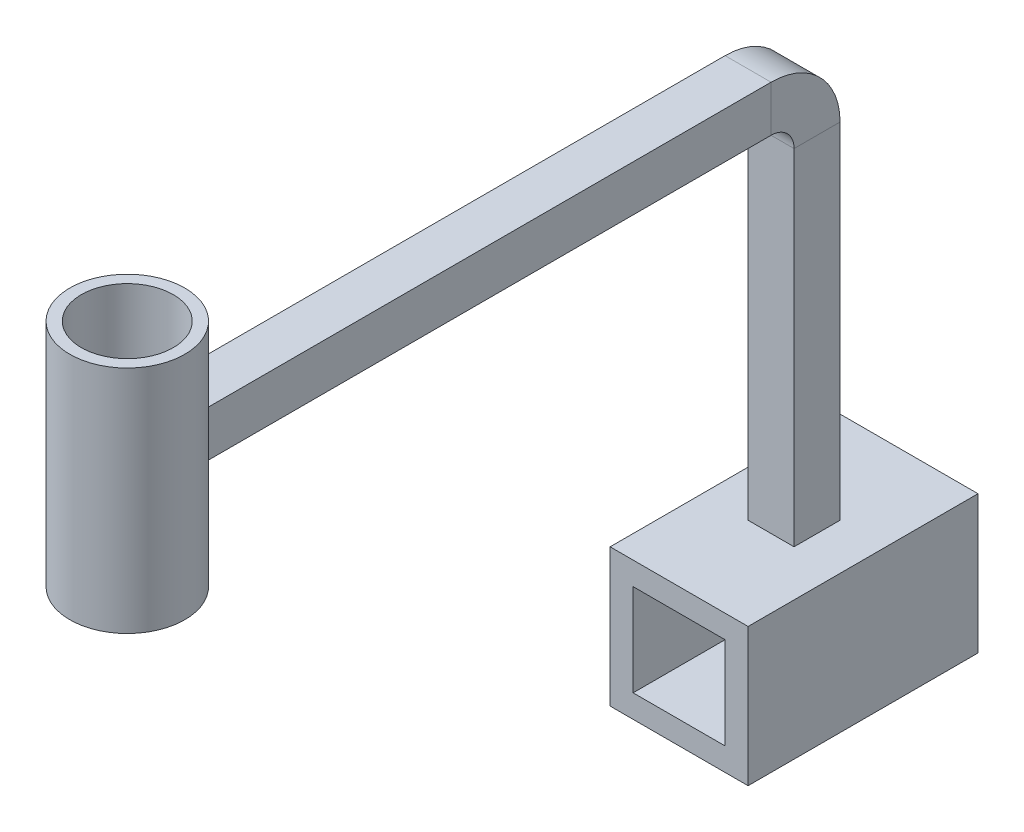
ISO-10303-21;
HEADER;
FILE_DESCRIPTION(('STEP AP214'),'2;1');
FILE_NAME('part.step','',(''),(''),'','','');
FILE_SCHEMA(('AUTOMOTIVE_DESIGN { 1 0 10303 214 1 1 1 1 }'));
ENDSEC;
DATA;
#1=APPLICATION_CONTEXT('core data for automotive mechanical design processes');
#2=APPLICATION_PROTOCOL_DEFINITION('international standard','automotive_design',2000,#1);
#3=PRODUCT_CONTEXT('',#1,'mechanical');
#4=PRODUCT('Part','Part','',(#3));
#5=PRODUCT_RELATED_PRODUCT_CATEGORY('part','',(#4));
#6=PRODUCT_DEFINITION_FORMATION('','',#4);
#7=PRODUCT_DEFINITION_CONTEXT('part definition',#1,'design');
#8=PRODUCT_DEFINITION('design','',#6,#7);
#9=PRODUCT_DEFINITION_SHAPE('','',#8);
#10=(LENGTH_UNIT() NAMED_UNIT(*) SI_UNIT(.MILLI.,.METRE.));
#11=(NAMED_UNIT(*) PLANE_ANGLE_UNIT() SI_UNIT($,.RADIAN.));
#12=(NAMED_UNIT(*) SI_UNIT($,.STERADIAN.) SOLID_ANGLE_UNIT());
#13=UNCERTAINTY_MEASURE_WITH_UNIT(LENGTH_MEASURE(1.E-05),#10,'distance_accuracy_value','');
#14=(GEOMETRIC_REPRESENTATION_CONTEXT(3) GLOBAL_UNCERTAINTY_ASSIGNED_CONTEXT((#13)) GLOBAL_UNIT_ASSIGNED_CONTEXT((#10,
#11,#12)) REPRESENTATION_CONTEXT('',''));
#15=CARTESIAN_POINT('',(0.,0.,0.));
#16=DIRECTION('',(0.,0.,1.));
#17=DIRECTION('',(1.,0.,0.));
#18=AXIS2_PLACEMENT_3D('',#15,#16,#17);
#19=CARTESIAN_POINT('',(-3.,3.,10.));
#20=DIRECTION('',(0.,-1.,0.));
#21=DIRECTION('',(0.,0.,-1.));
#22=AXIS2_PLACEMENT_3D('',#19,#20,#21);
#23=PLANE('',#22);
#24=DIRECTION('',(-1.,0.,0.));
#25=VECTOR('',#24,1.);
#26=CARTESIAN_POINT('',(-3.,3.,0.));
#27=LINE('',#26,#25);
#28=CARTESIAN_POINT('',(3.,3.,0.));
#29=VERTEX_POINT('',#28);
#30=CARTESIAN_POINT('',(-3.,3.,0.));
#31=VERTEX_POINT('',#30);
#32=EDGE_CURVE('E289',#29,#31,#27,.T.);
#33=ORIENTED_EDGE('',*,*,#32,.T.);
#34=DIRECTION('',(0.,0.,-1.));
#35=VECTOR('',#34,1.);
#36=CARTESIAN_POINT('',(-3.,3.,10.));
#37=LINE('',#36,#35);
#38=CARTESIAN_POINT('',(-3.,3.,10.));
#39=VERTEX_POINT('',#38);
#40=EDGE_CURVE('E299',#39,#31,#37,.T.);
#41=ORIENTED_EDGE('',*,*,#40,.F.);
#42=DIRECTION('',(-1.,0.,0.));
#43=VECTOR('',#42,1.);
#44=CARTESIAN_POINT('',(-3.,3.,10.));
#45=LINE('',#44,#43);
#46=CARTESIAN_POINT('',(3.,3.,10.));
#47=VERTEX_POINT('',#46);
#48=EDGE_CURVE('E279',#47,#39,#45,.T.);
#49=ORIENTED_EDGE('',*,*,#48,.F.);
#50=DIRECTION('',(0.,0.,-1.));
#51=VECTOR('',#50,1.);
#52=CARTESIAN_POINT('',(3.,3.,10.));
#53=LINE('',#52,#51);
#54=EDGE_CURVE('E52',#47,#29,#53,.T.);
#55=ORIENTED_EDGE('',*,*,#54,.T.);
#56=EDGE_LOOP('',(#33,#41,#49,#55));
#57=FACE_BOUND('',#56,.T.);
#58=DIRECTION('',(0.,0.,1.));
#59=VECTOR('',#58,1.);
#60=CARTESIAN_POINT('',(-0.999999999999999,3.,6.));
#61=LINE('',#60,#59);
#62=CARTESIAN_POINT('',(-0.999999999999999,3.,4.));
#63=VERTEX_POINT('',#62);
#64=CARTESIAN_POINT('',(-0.999999999999999,3.,6.));
#65=VERTEX_POINT('',#64);
#66=EDGE_CURVE('E211',#63,#65,#61,.T.);
#67=ORIENTED_EDGE('',*,*,#66,.F.);
#68=DIRECTION('',(-1.,0.,0.));
#69=VECTOR('',#68,1.);
#70=CARTESIAN_POINT('',(1.,3.,4.));
#71=LINE('',#70,#69);
#72=CARTESIAN_POINT('',(1.,3.,4.));
#73=VERTEX_POINT('',#72);
#74=EDGE_CURVE('E185',#73,#63,#71,.T.);
#75=ORIENTED_EDGE('',*,*,#74,.F.);
#76=DIRECTION('',(0.,0.,-1.));
#77=VECTOR('',#76,1.);
#78=CARTESIAN_POINT('',(1.,3.,6.));
#79=LINE('',#78,#77);
#80=CARTESIAN_POINT('',(1.,3.,6.));
#81=VERTEX_POINT('',#80);
#82=EDGE_CURVE('E171',#81,#73,#79,.T.);
#83=ORIENTED_EDGE('',*,*,#82,.F.);
#84=DIRECTION('',(1.,0.,0.));
#85=VECTOR('',#84,1.);
#86=CARTESIAN_POINT('',(1.,3.,6.));
#87=LINE('',#86,#85);
#88=EDGE_CURVE('E196',#65,#81,#87,.T.);
#89=ORIENTED_EDGE('',*,*,#88,.F.);
#90=EDGE_LOOP('',(#67,#75,#83,#89));
#91=FACE_BOUND('',#90,.T.);
#92=ADVANCED_FACE('F44',(#57,#91),#23,.F.);
#93=CARTESIAN_POINT('',(0.,0.,10.));
#94=DIRECTION('',(0.,0.,1.));
#95=DIRECTION('',(1.,0.,0.));
#96=AXIS2_PLACEMENT_3D('',#93,#94,#95);
#97=PLANE('',#96);
#98=DIRECTION('',(0.,1.,0.));
#99=VECTOR('',#98,1.);
#100=CARTESIAN_POINT('',(3.,3.,10.));
#101=LINE('',#100,#99);
#102=CARTESIAN_POINT('',(3.,-3.,10.));
#103=VERTEX_POINT('',#102);
#104=EDGE_CURVE('E276',#103,#47,#101,.T.);
#105=ORIENTED_EDGE('',*,*,#104,.T.);
#106=ORIENTED_EDGE('',*,*,#48,.T.);
#107=DIRECTION('',(0.,-1.,0.));
#108=VECTOR('',#107,1.);
#109=CARTESIAN_POINT('',(-3.,3.,10.));
#110=LINE('',#109,#108);
#111=CARTESIAN_POINT('',(-3.,-3.,10.));
#112=VERTEX_POINT('',#111);
#113=EDGE_CURVE('E282',#39,#112,#110,.T.);
#114=ORIENTED_EDGE('',*,*,#113,.T.);
#115=DIRECTION('',(1.,0.,0.));
#116=VECTOR('',#115,1.);
#117=CARTESIAN_POINT('',(-3.,-3.,10.));
#118=LINE('',#117,#116);
#119=EDGE_CURVE('E284',#112,#103,#118,.T.);
#120=ORIENTED_EDGE('',*,*,#119,.T.);
#121=EDGE_LOOP('',(#105,#106,#114,#120));
#122=FACE_BOUND('',#121,.T.);
#123=DIRECTION('',(-1.,0.,0.));
#124=VECTOR('',#123,1.);
#125=CARTESIAN_POINT('',(-2.,2.,10.));
#126=LINE('',#125,#124);
#127=CARTESIAN_POINT('',(2.,2.,10.));
#128=VERTEX_POINT('',#127);
#129=CARTESIAN_POINT('',(-2.,2.,10.));
#130=VERTEX_POINT('',#129);
#131=EDGE_CURVE('E247',#128,#130,#126,.T.);
#132=ORIENTED_EDGE('',*,*,#131,.F.);
#133=DIRECTION('',(0.,1.,0.));
#134=VECTOR('',#133,1.);
#135=CARTESIAN_POINT('',(2.,2.,10.));
#136=LINE('',#135,#134);
#137=CARTESIAN_POINT('',(2.,-2.,10.));
#138=VERTEX_POINT('',#137);
#139=EDGE_CURVE('E245',#138,#128,#136,.T.);
#140=ORIENTED_EDGE('',*,*,#139,.F.);
#141=DIRECTION('',(1.,0.,0.));
#142=VECTOR('',#141,1.);
#143=CARTESIAN_POINT('',(-2.,-2.,10.));
#144=LINE('',#143,#142);
#145=CARTESIAN_POINT('',(-2.,-2.,10.));
#146=VERTEX_POINT('',#145);
#147=EDGE_CURVE('E253',#146,#138,#144,.T.);
#148=ORIENTED_EDGE('',*,*,#147,.F.);
#149=DIRECTION('',(0.,-1.,0.));
#150=VECTOR('',#149,1.);
#151=CARTESIAN_POINT('',(-2.,2.,10.));
#152=LINE('',#151,#150);
#153=EDGE_CURVE('E250',#130,#146,#152,.T.);
#154=ORIENTED_EDGE('',*,*,#153,.F.);
#155=EDGE_LOOP('',(#132,#140,#148,#154));
#156=FACE_BOUND('',#155,.T.);
#157=ADVANCED_FACE('F323',(#122,#156),#97,.T.);
#158=CARTESIAN_POINT('',(0.,0.,0.));
#159=DIRECTION('',(0.,0.,1.));
#160=DIRECTION('',(1.,0.,0.));
#161=AXIS2_PLACEMENT_3D('',#158,#159,#160);
#162=PLANE('',#161);
#163=DIRECTION('',(0.,1.,0.));
#164=VECTOR('',#163,1.);
#165=CARTESIAN_POINT('',(3.,3.,0.));
#166=LINE('',#165,#164);
#167=CARTESIAN_POINT('',(3.,-3.,0.));
#168=VERTEX_POINT('',#167);
#169=EDGE_CURVE('E275',#168,#29,#166,.T.);
#170=ORIENTED_EDGE('',*,*,#169,.F.);
#171=DIRECTION('',(1.,0.,0.));
#172=VECTOR('',#171,1.);
#173=CARTESIAN_POINT('',(-3.,-3.,0.));
#174=LINE('',#173,#172);
#175=CARTESIAN_POINT('',(-3.,-3.,0.));
#176=VERTEX_POINT('',#175);
#177=EDGE_CURVE('E280',#176,#168,#174,.T.);
#178=ORIENTED_EDGE('',*,*,#177,.F.);
#179=DIRECTION('',(0.,-1.,0.));
#180=VECTOR('',#179,1.);
#181=CARTESIAN_POINT('',(-3.,3.,0.));
#182=LINE('',#181,#180);
#183=EDGE_CURVE('E291',#31,#176,#182,.T.);
#184=ORIENTED_EDGE('',*,*,#183,.F.);
#185=ORIENTED_EDGE('',*,*,#32,.F.);
#186=EDGE_LOOP('',(#170,#178,#184,#185));
#187=FACE_BOUND('',#186,.T.);
#188=DIRECTION('',(0.,1.,0.));
#189=VECTOR('',#188,1.);
#190=CARTESIAN_POINT('',(2.,2.,0.));
#191=LINE('',#190,#189);
#192=CARTESIAN_POINT('',(2.,-2.,0.));
#193=VERTEX_POINT('',#192);
#194=CARTESIAN_POINT('',(2.,2.,0.));
#195=VERTEX_POINT('',#194);
#196=EDGE_CURVE('E239',#193,#195,#191,.T.);
#197=ORIENTED_EDGE('',*,*,#196,.T.);
#198=DIRECTION('',(-1.,0.,0.));
#199=VECTOR('',#198,1.);
#200=CARTESIAN_POINT('',(-2.,2.,0.));
#201=LINE('',#200,#199);
#202=CARTESIAN_POINT('',(-2.,2.,0.));
#203=VERTEX_POINT('',#202);
#204=EDGE_CURVE('E258',#195,#203,#201,.T.);
#205=ORIENTED_EDGE('',*,*,#204,.T.);
#206=DIRECTION('',(0.,-1.,0.));
#207=VECTOR('',#206,1.);
#208=CARTESIAN_POINT('',(-2.,2.,0.));
#209=LINE('',#208,#207);
#210=CARTESIAN_POINT('',(-2.,-2.,0.));
#211=VERTEX_POINT('',#210);
#212=EDGE_CURVE('E261',#203,#211,#209,.T.);
#213=ORIENTED_EDGE('',*,*,#212,.T.);
#214=DIRECTION('',(1.,0.,0.));
#215=VECTOR('',#214,1.);
#216=CARTESIAN_POINT('',(-2.,-2.,0.));
#217=LINE('',#216,#215);
#218=EDGE_CURVE('E248',#211,#193,#217,.T.);
#219=ORIENTED_EDGE('',*,*,#218,.T.);
#220=EDGE_LOOP('',(#197,#205,#213,#219));
#221=FACE_BOUND('',#220,.T.);
#222=ADVANCED_FACE('F312',(#187,#221),#162,.F.);
#223=CARTESIAN_POINT('',(3.,3.,10.));
#224=DIRECTION('',(-1.,0.,0.));
#225=DIRECTION('',(0.,-1.,0.));
#226=AXIS2_PLACEMENT_3D('',#223,#224,#225);
#227=PLANE('',#226);
#228=ORIENTED_EDGE('',*,*,#169,.T.);
#229=ORIENTED_EDGE('',*,*,#54,.F.);
#230=ORIENTED_EDGE('',*,*,#104,.F.);
#231=DIRECTION('',(0.,0.,-1.));
#232=VECTOR('',#231,1.);
#233=CARTESIAN_POINT('',(3.,-3.,10.));
#234=LINE('',#233,#232);
#235=EDGE_CURVE('E286',#103,#168,#234,.T.);
#236=ORIENTED_EDGE('',*,*,#235,.T.);
#237=EDGE_LOOP('',(#228,#229,#230,#236));
#238=FACE_BOUND('',#237,.T.);
#239=ADVANCED_FACE('F46',(#238),#227,.F.);
#240=CARTESIAN_POINT('',(-3.,3.,10.));
#241=DIRECTION('',(1.,0.,0.));
#242=DIRECTION('',(0.,1.,0.));
#243=AXIS2_PLACEMENT_3D('',#240,#241,#242);
#244=PLANE('',#243);
#245=ORIENTED_EDGE('',*,*,#183,.T.);
#246=DIRECTION('',(0.,0.,-1.));
#247=VECTOR('',#246,1.);
#248=CARTESIAN_POINT('',(-3.,-3.,10.));
#249=LINE('',#248,#247);
#250=EDGE_CURVE('E296',#112,#176,#249,.T.);
#251=ORIENTED_EDGE('',*,*,#250,.F.);
#252=ORIENTED_EDGE('',*,*,#113,.F.);
#253=ORIENTED_EDGE('',*,*,#40,.T.);
#254=EDGE_LOOP('',(#245,#251,#252,#253));
#255=FACE_BOUND('',#254,.T.);
#256=ADVANCED_FACE('F317',(#255),#244,.F.);
#257=CARTESIAN_POINT('',(-3.,-3.,10.));
#258=DIRECTION('',(0.,1.,0.));
#259=DIRECTION('',(0.,0.,1.));
#260=AXIS2_PLACEMENT_3D('',#257,#258,#259);
#261=PLANE('',#260);
#262=ORIENTED_EDGE('',*,*,#177,.T.);
#263=ORIENTED_EDGE('',*,*,#235,.F.);
#264=ORIENTED_EDGE('',*,*,#119,.F.);
#265=ORIENTED_EDGE('',*,*,#250,.T.);
#266=EDGE_LOOP('',(#262,#263,#264,#265));
#267=FACE_BOUND('',#266,.T.);
#268=ADVANCED_FACE('F321',(#267),#261,.F.);
#269=CARTESIAN_POINT('',(2.,2.,10.));
#270=DIRECTION('',(-1.,0.,0.));
#271=DIRECTION('',(0.,-1.,0.));
#272=AXIS2_PLACEMENT_3D('',#269,#270,#271);
#273=PLANE('',#272);
#274=ORIENTED_EDGE('',*,*,#196,.F.);
#275=DIRECTION('',(0.,0.,-1.));
#276=VECTOR('',#275,1.);
#277=CARTESIAN_POINT('',(2.,-2.,10.));
#278=LINE('',#277,#276);
#279=EDGE_CURVE('E255',#138,#193,#278,.T.);
#280=ORIENTED_EDGE('',*,*,#279,.F.);
#281=ORIENTED_EDGE('',*,*,#139,.T.);
#282=DIRECTION('',(0.,0.,-1.));
#283=VECTOR('',#282,1.);
#284=CARTESIAN_POINT('',(2.,2.,10.));
#285=LINE('',#284,#283);
#286=EDGE_CURVE('E272',#128,#195,#285,.T.);
#287=ORIENTED_EDGE('',*,*,#286,.T.);
#288=EDGE_LOOP('',(#274,#280,#281,#287));
#289=FACE_BOUND('',#288,.T.);
#290=ADVANCED_FACE('F340',(#289),#273,.T.);
#291=CARTESIAN_POINT('',(-2.,2.,10.));
#292=DIRECTION('',(0.,-1.,0.));
#293=DIRECTION('',(0.,0.,-1.));
#294=AXIS2_PLACEMENT_3D('',#291,#292,#293);
#295=PLANE('',#294);
#296=ORIENTED_EDGE('',*,*,#204,.F.);
#297=ORIENTED_EDGE('',*,*,#286,.F.);
#298=ORIENTED_EDGE('',*,*,#131,.T.);
#299=DIRECTION('',(0.,0.,-1.));
#300=VECTOR('',#299,1.);
#301=CARTESIAN_POINT('',(-2.,2.,10.));
#302=LINE('',#301,#300);
#303=EDGE_CURVE('E270',#130,#203,#302,.T.);
#304=ORIENTED_EDGE('',*,*,#303,.T.);
#305=EDGE_LOOP('',(#296,#297,#298,#304));
#306=FACE_BOUND('',#305,.T.);
#307=ADVANCED_FACE('F334',(#306),#295,.T.);
#308=CARTESIAN_POINT('',(-2.,2.,10.));
#309=DIRECTION('',(1.,0.,0.));
#310=DIRECTION('',(0.,1.,0.));
#311=AXIS2_PLACEMENT_3D('',#308,#309,#310);
#312=PLANE('',#311);
#313=ORIENTED_EDGE('',*,*,#212,.F.);
#314=ORIENTED_EDGE('',*,*,#303,.F.);
#315=ORIENTED_EDGE('',*,*,#153,.T.);
#316=DIRECTION('',(0.,0.,-1.));
#317=VECTOR('',#316,1.);
#318=CARTESIAN_POINT('',(-2.,-2.,10.));
#319=LINE('',#318,#317);
#320=EDGE_CURVE('E268',#146,#211,#319,.T.);
#321=ORIENTED_EDGE('',*,*,#320,.T.);
#322=EDGE_LOOP('',(#313,#314,#315,#321));
#323=FACE_BOUND('',#322,.T.);
#324=ADVANCED_FACE('F337',(#323),#312,.T.);
#325=CARTESIAN_POINT('',(-2.,-2.,10.));
#326=DIRECTION('',(0.,1.,0.));
#327=DIRECTION('',(0.,0.,1.));
#328=AXIS2_PLACEMENT_3D('',#325,#326,#327);
#329=PLANE('',#328);
#330=ORIENTED_EDGE('',*,*,#218,.F.);
#331=ORIENTED_EDGE('',*,*,#320,.F.);
#332=ORIENTED_EDGE('',*,*,#147,.T.);
#333=ORIENTED_EDGE('',*,*,#279,.T.);
#334=EDGE_LOOP('',(#330,#331,#332,#333));
#335=FACE_BOUND('',#334,.T.);
#336=ADVANCED_FACE('F343',(#335),#329,.T.);
#337=CARTESIAN_POINT('',(1.,3.,6.));
#338=DIRECTION('',(1.,0.,0.));
#339=DIRECTION('',(0.,0.,-1.));
#340=AXIS2_PLACEMENT_3D('',#337,#338,#339);
#341=PLANE('',#340);
#342=DIRECTION('',(0.,1.,0.));
#343=VECTOR('',#342,1.);
#344=CARTESIAN_POINT('',(1.,3.,4.));
#345=LINE('',#344,#343);
#346=CARTESIAN_POINT('',(1.,18.,4.));
#347=VERTEX_POINT('',#346);
#348=EDGE_CURVE('E189',#73,#347,#345,.T.);
#349=ORIENTED_EDGE('',*,*,#348,.T.);
#350=DIRECTION('',(0.,0.,-1.));
#351=VECTOR('',#350,1.);
#352=CARTESIAN_POINT('',(1.,18.,6.));
#353=LINE('',#352,#351);
#354=CARTESIAN_POINT('',(1.,18.,6.));
#355=VERTEX_POINT('',#354);
#356=EDGE_CURVE('E186',#355,#347,#353,.T.);
#357=ORIENTED_EDGE('',*,*,#356,.F.);
#358=DIRECTION('',(0.,1.,0.));
#359=VECTOR('',#358,1.);
#360=CARTESIAN_POINT('',(1.,3.,6.));
#361=LINE('',#360,#359);
#362=EDGE_CURVE('E190',#81,#355,#361,.T.);
#363=ORIENTED_EDGE('',*,*,#362,.F.);
#364=ORIENTED_EDGE('',*,*,#82,.T.);
#365=EDGE_LOOP('',(#349,#357,#363,#364));
#366=FACE_BOUND('',#365,.T.);
#367=ADVANCED_FACE('F345',(#366),#341,.T.);
#368=CARTESIAN_POINT('',(1.,3.,4.));
#369=DIRECTION('',(0.,0.,-1.));
#370=DIRECTION('',(0.,1.,0.));
#371=AXIS2_PLACEMENT_3D('',#368,#369,#370);
#372=PLANE('',#371);
#373=DIRECTION('',(0.,1.,0.));
#374=VECTOR('',#373,1.);
#375=CARTESIAN_POINT('',(-0.999999999999999,3.,4.));
#376=LINE('',#375,#374);
#377=CARTESIAN_POINT('',(-0.999999999999999,18.,4.));
#378=VERTEX_POINT('',#377);
#379=EDGE_CURVE('E214',#63,#378,#376,.T.);
#380=ORIENTED_EDGE('',*,*,#379,.T.);
#381=DIRECTION('',(-1.,0.,0.));
#382=VECTOR('',#381,1.);
#383=CARTESIAN_POINT('',(1.,18.,4.));
#384=LINE('',#383,#382);
#385=EDGE_CURVE('E193',#347,#378,#384,.T.);
#386=ORIENTED_EDGE('',*,*,#385,.F.);
#387=ORIENTED_EDGE('',*,*,#348,.F.);
#388=ORIENTED_EDGE('',*,*,#74,.T.);
#389=EDGE_LOOP('',(#380,#386,#387,#388));
#390=FACE_BOUND('',#389,.T.);
#391=ADVANCED_FACE('F351',(#390),#372,.T.);
#392=CARTESIAN_POINT('',(-0.999999999999999,3.,6.));
#393=DIRECTION('',(-1.,0.,0.));
#394=DIRECTION('',(0.,0.,1.));
#395=AXIS2_PLACEMENT_3D('',#392,#393,#394);
#396=PLANE('',#395);
#397=DIRECTION('',(0.,1.,0.));
#398=VECTOR('',#397,1.);
#399=CARTESIAN_POINT('',(-0.999999999999999,3.,6.));
#400=LINE('',#399,#398);
#401=CARTESIAN_POINT('',(-0.999999999999999,18.,6.));
#402=VERTEX_POINT('',#401);
#403=EDGE_CURVE('E230',#65,#402,#400,.T.);
#404=ORIENTED_EDGE('',*,*,#403,.T.);
#405=DIRECTION('',(0.,0.,1.));
#406=VECTOR('',#405,1.);
#407=CARTESIAN_POINT('',(-0.999999999999999,18.,6.));
#408=LINE('',#407,#406);
#409=EDGE_CURVE('E217',#378,#402,#408,.T.);
#410=ORIENTED_EDGE('',*,*,#409,.F.);
#411=ORIENTED_EDGE('',*,*,#379,.F.);
#412=ORIENTED_EDGE('',*,*,#66,.T.);
#413=EDGE_LOOP('',(#404,#410,#411,#412));
#414=FACE_BOUND('',#413,.T.);
#415=ADVANCED_FACE('F402',(#414),#396,.T.);
#416=CARTESIAN_POINT('',(1.,3.,6.));
#417=DIRECTION('',(0.,0.,1.));
#418=DIRECTION('',(0.,-1.,0.));
#419=AXIS2_PLACEMENT_3D('',#416,#417,#418);
#420=PLANE('',#419);
#421=DIRECTION('',(1.,0.,0.));
#422=VECTOR('',#421,1.);
#423=CARTESIAN_POINT('',(1.,18.,6.));
#424=LINE('',#423,#422);
#425=EDGE_CURVE('E206',#402,#355,#424,.T.);
#426=ORIENTED_EDGE('',*,*,#425,.F.);
#427=ORIENTED_EDGE('',*,*,#403,.F.);
#428=ORIENTED_EDGE('',*,*,#88,.T.);
#429=ORIENTED_EDGE('',*,*,#362,.T.);
#430=EDGE_LOOP('',(#426,#427,#428,#429));
#431=FACE_BOUND('',#430,.T.);
#432=ADVANCED_FACE('F412',(#431),#420,.T.);
#433=CARTESIAN_POINT('',(1.,18.,6.));
#434=DIRECTION('',(1.,0.,0.));
#435=DIRECTION('',(0.,0.,-1.));
#436=AXIS2_PLACEMENT_3D('',#433,#434,#435);
#437=PLANE('',#436);
#438=CARTESIAN_POINT('',(1.,18.,7.));
#439=DIRECTION('',(1.,0.,0.));
#440=DIRECTION('',(0.,0.,-1.));
#441=AXIS2_PLACEMENT_3D('',#438,#439,#440);
#442=CIRCLE('',#441,3.);
#443=CARTESIAN_POINT('',(1.,21.,7.));
#444=VERTEX_POINT('',#443);
#445=EDGE_CURVE('E199',#347,#444,#442,.T.);
#446=ORIENTED_EDGE('',*,*,#445,.T.);
#447=DIRECTION('',(0.,1.,0.));
#448=VECTOR('',#447,1.);
#449=CARTESIAN_POINT('',(1.,19.,7.));
#450=LINE('',#449,#448);
#451=CARTESIAN_POINT('',(1.,19.,7.));
#452=VERTEX_POINT('',#451);
#453=EDGE_CURVE('E197',#452,#444,#450,.T.);
#454=ORIENTED_EDGE('',*,*,#453,.F.);
#455=CARTESIAN_POINT('',(1.,18.,7.));
#456=DIRECTION('',(1.,0.,0.));
#457=DIRECTION('',(0.,0.,-1.));
#458=AXIS2_PLACEMENT_3D('',#455,#456,#457);
#459=CIRCLE('',#458,1.);
#460=EDGE_CURVE('E200',#355,#452,#459,.T.);
#461=ORIENTED_EDGE('',*,*,#460,.F.);
#462=ORIENTED_EDGE('',*,*,#356,.T.);
#463=EDGE_LOOP('',(#446,#454,#461,#462));
#464=FACE_BOUND('',#463,.T.);
#465=ADVANCED_FACE('F422',(#464),#437,.T.);
#466=CARTESIAN_POINT('',(0.,18.,7.));
#467=DIRECTION('',(1.,0.,0.));
#468=DIRECTION('',(0.,0.,-1.));
#469=AXIS2_PLACEMENT_3D('',#466,#467,#468);
#470=CYLINDRICAL_SURFACE('',#469,3.);
#471=CARTESIAN_POINT('',(-0.999999999999999,18.,7.));
#472=DIRECTION('',(1.,0.,0.));
#473=DIRECTION('',(0.,0.,-1.));
#474=AXIS2_PLACEMENT_3D('',#471,#472,#473);
#475=CIRCLE('',#474,3.);
#476=CARTESIAN_POINT('',(-0.999999999999999,21.,7.));
#477=VERTEX_POINT('',#476);
#478=EDGE_CURVE('E220',#378,#477,#475,.T.);
#479=ORIENTED_EDGE('',*,*,#478,.T.);
#480=DIRECTION('',(-1.,0.,0.));
#481=VECTOR('',#480,1.);
#482=CARTESIAN_POINT('',(1.,21.,7.));
#483=LINE('',#482,#481);
#484=EDGE_CURVE('E203',#444,#477,#483,.T.);
#485=ORIENTED_EDGE('',*,*,#484,.F.);
#486=ORIENTED_EDGE('',*,*,#445,.F.);
#487=ORIENTED_EDGE('',*,*,#385,.T.);
#488=EDGE_LOOP('',(#479,#485,#486,#487));
#489=FACE_BOUND('',#488,.T.);
#490=ADVANCED_FACE('F432',(#489),#470,.T.);
#491=CARTESIAN_POINT('',(-0.999999999999999,18.,6.));
#492=DIRECTION('',(-1.,0.,0.));
#493=DIRECTION('',(0.,0.,1.));
#494=AXIS2_PLACEMENT_3D('',#491,#492,#493);
#495=PLANE('',#494);
#496=CARTESIAN_POINT('',(-0.999999999999999,18.,7.));
#497=DIRECTION('',(1.,0.,0.));
#498=DIRECTION('',(0.,0.,-1.));
#499=AXIS2_PLACEMENT_3D('',#496,#497,#498);
#500=CIRCLE('',#499,1.);
#501=CARTESIAN_POINT('',(-0.999999999999999,19.,7.));
#502=VERTEX_POINT('',#501);
#503=EDGE_CURVE('E235',#402,#502,#500,.T.);
#504=ORIENTED_EDGE('',*,*,#503,.T.);
#505=DIRECTION('',(0.,-1.,0.));
#506=VECTOR('',#505,1.);
#507=CARTESIAN_POINT('',(-0.999999999999999,19.,7.));
#508=LINE('',#507,#506);
#509=EDGE_CURVE('E223',#477,#502,#508,.T.);
#510=ORIENTED_EDGE('',*,*,#509,.F.);
#511=ORIENTED_EDGE('',*,*,#478,.F.);
#512=ORIENTED_EDGE('',*,*,#409,.T.);
#513=EDGE_LOOP('',(#504,#510,#511,#512));
#514=FACE_BOUND('',#513,.T.);
#515=ADVANCED_FACE('F442',(#514),#495,.T.);
#516=CARTESIAN_POINT('',(0.,18.,7.));
#517=DIRECTION('',(1.,0.,0.));
#518=DIRECTION('',(0.,0.,-1.));
#519=AXIS2_PLACEMENT_3D('',#516,#517,#518);
#520=CYLINDRICAL_SURFACE('',#519,1.);
#521=DIRECTION('',(1.,0.,0.));
#522=VECTOR('',#521,1.);
#523=CARTESIAN_POINT('',(1.,19.,7.));
#524=LINE('',#523,#522);
#525=EDGE_CURVE('E161',#502,#452,#524,.T.);
#526=ORIENTED_EDGE('',*,*,#525,.F.);
#527=ORIENTED_EDGE('',*,*,#503,.F.);
#528=ORIENTED_EDGE('',*,*,#425,.T.);
#529=ORIENTED_EDGE('',*,*,#460,.T.);
#530=EDGE_LOOP('',(#526,#527,#528,#529));
#531=FACE_BOUND('',#530,.T.);
#532=ADVANCED_FACE('F452',(#531),#520,.F.);
#533=CARTESIAN_POINT('',(1.,19.,7.));
#534=DIRECTION('',(1.,0.,0.));
#535=DIRECTION('',(0.,0.,-1.));
#536=AXIS2_PLACEMENT_3D('',#533,#534,#535);
#537=PLANE('',#536);
#538=DIRECTION('',(0.,-1.,0.));
#539=VECTOR('',#538,1.);
#540=CARTESIAN_POINT('',(1.,25.,31.7087121525221));
#541=LINE('',#540,#539);
#542=CARTESIAN_POINT('',(1.,19.,31.7087121525221));
#543=VERTEX_POINT('',#542);
#544=CARTESIAN_POINT('',(1.,21.,31.7087121525221));
#545=VERTEX_POINT('',#544);
#546=EDGE_CURVE('E168',#543,#545,#541,.F.);
#547=ORIENTED_EDGE('',*,*,#546,.F.);
#548=DIRECTION('',(0.,0.,1.));
#549=VECTOR('',#548,1.);
#550=CARTESIAN_POINT('',(1.,19.,7.));
#551=LINE('',#550,#549);
#552=EDGE_CURVE('E157',#452,#543,#551,.T.);
#553=ORIENTED_EDGE('',*,*,#552,.F.);
#554=ORIENTED_EDGE('',*,*,#453,.T.);
#555=DIRECTION('',(0.,0.,1.));
#556=VECTOR('',#555,1.);
#557=CARTESIAN_POINT('',(1.,21.,7.));
#558=LINE('',#557,#556);
#559=EDGE_CURVE('E165',#444,#545,#558,.T.);
#560=ORIENTED_EDGE('',*,*,#559,.T.);
#561=EDGE_LOOP('',(#547,#553,#554,#560));
#562=FACE_BOUND('',#561,.T.);
#563=ADVANCED_FACE('F169',(#562),#537,.T.);
#564=CARTESIAN_POINT('',(1.,21.,7.));
#565=DIRECTION('',(0.,1.,0.));
#566=DIRECTION('',(0.,0.,1.));
#567=AXIS2_PLACEMENT_3D('',#564,#565,#566);
#568=PLANE('',#567);
#569=CARTESIAN_POINT('',(0.,21.,34.));
#570=DIRECTION('',(0.,1.,0.));
#571=DIRECTION('',(0.,0.,1.));
#572=AXIS2_PLACEMENT_3D('',#569,#570,#571);
#573=CIRCLE('',#572,2.5);
#574=CARTESIAN_POINT('',(-0.999999999999999,21.,31.7087121525221));
#575=VERTEX_POINT('',#574);
#576=EDGE_CURVE('E59',#545,#575,#573,.T.);
#577=ORIENTED_EDGE('',*,*,#576,.F.);
#578=ORIENTED_EDGE('',*,*,#559,.F.);
#579=ORIENTED_EDGE('',*,*,#484,.T.);
#580=DIRECTION('',(0.,0.,1.));
#581=VECTOR('',#580,1.);
#582=CARTESIAN_POINT('',(-0.999999999999999,21.,7.));
#583=LINE('',#582,#581);
#584=EDGE_CURVE('E207',#477,#575,#583,.T.);
#585=ORIENTED_EDGE('',*,*,#584,.T.);
#586=EDGE_LOOP('',(#577,#578,#579,#585));
#587=FACE_BOUND('',#586,.T.);
#588=ADVANCED_FACE('F471',(#587),#568,.T.);
#589=CARTESIAN_POINT('',(-0.999999999999999,19.,7.));
#590=DIRECTION('',(-1.,0.,0.));
#591=DIRECTION('',(0.,0.,1.));
#592=AXIS2_PLACEMENT_3D('',#589,#590,#591);
#593=PLANE('',#592);
#594=DIRECTION('',(0.,-1.,0.));
#595=VECTOR('',#594,1.);
#596=CARTESIAN_POINT('',(-0.999999999999999,25.,31.7087121525221));
#597=LINE('',#596,#595);
#598=CARTESIAN_POINT('',(-0.999999999999999,19.,31.7087121525221));
#599=VERTEX_POINT('',#598);
#600=EDGE_CURVE('E67',#575,#599,#597,.T.);
#601=ORIENTED_EDGE('',*,*,#600,.F.);
#602=ORIENTED_EDGE('',*,*,#584,.F.);
#603=ORIENTED_EDGE('',*,*,#509,.T.);
#604=DIRECTION('',(0.,0.,1.));
#605=VECTOR('',#604,1.);
#606=CARTESIAN_POINT('',(-0.999999999999999,19.,7.));
#607=LINE('',#606,#605);
#608=EDGE_CURVE('E225',#502,#599,#607,.T.);
#609=ORIENTED_EDGE('',*,*,#608,.T.);
#610=EDGE_LOOP('',(#601,#602,#603,#609));
#611=FACE_BOUND('',#610,.T.);
#612=ADVANCED_FACE('F357',(#611),#593,.T.);
#613=CARTESIAN_POINT('',(1.,19.,7.));
#614=DIRECTION('',(0.,-1.,0.));
#615=DIRECTION('',(0.,0.,-1.));
#616=AXIS2_PLACEMENT_3D('',#613,#614,#615);
#617=PLANE('',#616);
#618=CARTESIAN_POINT('',(0.,19.,34.));
#619=DIRECTION('',(0.,-1.,0.));
#620=DIRECTION('',(0.,0.,-1.));
#621=AXIS2_PLACEMENT_3D('',#618,#619,#620);
#622=CIRCLE('',#621,2.5);
#623=EDGE_CURVE('E12',#599,#543,#622,.T.);
#624=ORIENTED_EDGE('',*,*,#623,.F.);
#625=ORIENTED_EDGE('',*,*,#608,.F.);
#626=ORIENTED_EDGE('',*,*,#525,.T.);
#627=ORIENTED_EDGE('',*,*,#552,.T.);
#628=EDGE_LOOP('',(#624,#625,#626,#627));
#629=FACE_BOUND('',#628,.T.);
#630=ADVANCED_FACE('F159',(#629),#617,.T.);
#631=CARTESIAN_POINT('',(0.,25.,34.));
#632=DIRECTION('',(0.,-1.,0.));
#633=DIRECTION('',(0.,0.,-1.));
#634=AXIS2_PLACEMENT_3D('',#631,#632,#633);
#635=CYLINDRICAL_SURFACE('',#634,2.5);
#636=ORIENTED_EDGE('',*,*,#623,.T.);
#637=ORIENTED_EDGE('',*,*,#546,.T.);
#638=ORIENTED_EDGE('',*,*,#576,.T.);
#639=ORIENTED_EDGE('',*,*,#600,.T.);
#640=EDGE_LOOP('',(#636,#637,#638,#639));
#641=FACE_BOUND('',#640,.T.);
#642=CARTESIAN_POINT('',(0.,25.,34.));
#643=DIRECTION('',(0.,-1.,0.));
#644=DIRECTION('',(0.,0.,-1.));
#645=AXIS2_PLACEMENT_3D('',#642,#643,#644);
#646=CIRCLE('',#645,2.5);
#647=CARTESIAN_POINT('',(0.,25.,31.5));
#648=VERTEX_POINT('',#647);
#649=EDGE_CURVE('E175',#648,#648,#646,.T.);
#650=ORIENTED_EDGE('',*,*,#649,.T.);
#651=EDGE_LOOP('',(#650));
#652=FACE_BOUND('',#651,.T.);
#653=CARTESIAN_POINT('',(0.,15.,34.));
#654=DIRECTION('',(0.,-1.,0.));
#655=DIRECTION('',(0.,0.,-1.));
#656=AXIS2_PLACEMENT_3D('',#653,#654,#655);
#657=CIRCLE('',#656,2.5);
#658=CARTESIAN_POINT('',(0.,15.,31.5));
#659=VERTEX_POINT('',#658);
#660=EDGE_CURVE('E538',#659,#659,#657,.T.);
#661=ORIENTED_EDGE('',*,*,#660,.F.);
#662=EDGE_LOOP('',(#661));
#663=FACE_BOUND('',#662,.T.);
#664=ADVANCED_FACE('F173',(#641,#652,#663),#635,.T.);
#665=CARTESIAN_POINT('',(0.,25.,34.));
#666=DIRECTION('',(0.,-1.,0.));
#667=DIRECTION('',(0.,0.,-1.));
#668=AXIS2_PLACEMENT_3D('',#665,#666,#667);
#669=PLANE('',#668);
#670=CARTESIAN_POINT('',(0.,25.,34.));
#671=DIRECTION('',(0.,-1.,0.));
#672=DIRECTION('',(0.,0.,-1.));
#673=AXIS2_PLACEMENT_3D('',#670,#671,#672);
#674=CIRCLE('',#673,2.);
#675=CARTESIAN_POINT('',(0.,25.,32.));
#676=VERTEX_POINT('',#675);
#677=EDGE_CURVE('E179',#676,#676,#674,.T.);
#678=ORIENTED_EDGE('',*,*,#677,.T.);
#679=EDGE_LOOP('',(#678));
#680=FACE_BOUND('',#679,.T.);
#681=ORIENTED_EDGE('',*,*,#649,.F.);
#682=EDGE_LOOP('',(#681));
#683=FACE_BOUND('',#682,.T.);
#684=ADVANCED_FACE('F502',(#680,#683),#669,.F.);
#685=CARTESIAN_POINT('',(0.,25.,34.));
#686=DIRECTION('',(0.,-1.,0.));
#687=DIRECTION('',(0.,0.,-1.));
#688=AXIS2_PLACEMENT_3D('',#685,#686,#687);
#689=CYLINDRICAL_SURFACE('',#688,2.);
#690=ORIENTED_EDGE('',*,*,#677,.F.);
#691=EDGE_LOOP('',(#690));
#692=FACE_BOUND('',#691,.T.);
#693=CARTESIAN_POINT('',(0.,15.,34.));
#694=DIRECTION('',(0.,-1.,0.));
#695=DIRECTION('',(0.,0.,-1.));
#696=AXIS2_PLACEMENT_3D('',#693,#694,#695);
#697=CIRCLE('',#696,2.);
#698=CARTESIAN_POINT('',(0.,15.,32.));
#699=VERTEX_POINT('',#698);
#700=EDGE_CURVE('E541',#699,#699,#697,.T.);
#701=ORIENTED_EDGE('',*,*,#700,.T.);
#702=EDGE_LOOP('',(#701));
#703=FACE_BOUND('',#702,.T.);
#704=ADVANCED_FACE('F511',(#692,#703),#689,.F.);
#705=CARTESIAN_POINT('',(0.,15.,34.));
#706=DIRECTION('',(0.,-1.,0.));
#707=DIRECTION('',(0.,0.,-1.));
#708=AXIS2_PLACEMENT_3D('',#705,#706,#707);
#709=PLANE('',#708);
#710=ORIENTED_EDGE('',*,*,#660,.T.);
#711=EDGE_LOOP('',(#710));
#712=FACE_BOUND('',#711,.T.);
#713=ORIENTED_EDGE('',*,*,#700,.F.);
#714=EDGE_LOOP('',(#713));
#715=FACE_BOUND('',#714,.T.);
#716=ADVANCED_FACE('F521',(#712,#715),#709,.T.);
#717=CLOSED_SHELL('',(#92,#157,#222,#239,#256,#268,#290,#307,#324,#336,#367,#391,#415,#432,#465,
#490,#515,#532,#563,#588,#612,#630,#664,#684,#704,#716));
#718=MANIFOLD_SOLID_BREP('B2',#717);
#719=ADVANCED_BREP_SHAPE_REPRESENTATION('',(#18,#718),#14);
#720=SHAPE_DEFINITION_REPRESENTATION(#9,#719);
ENDSEC;
END-ISO-10303-21;
